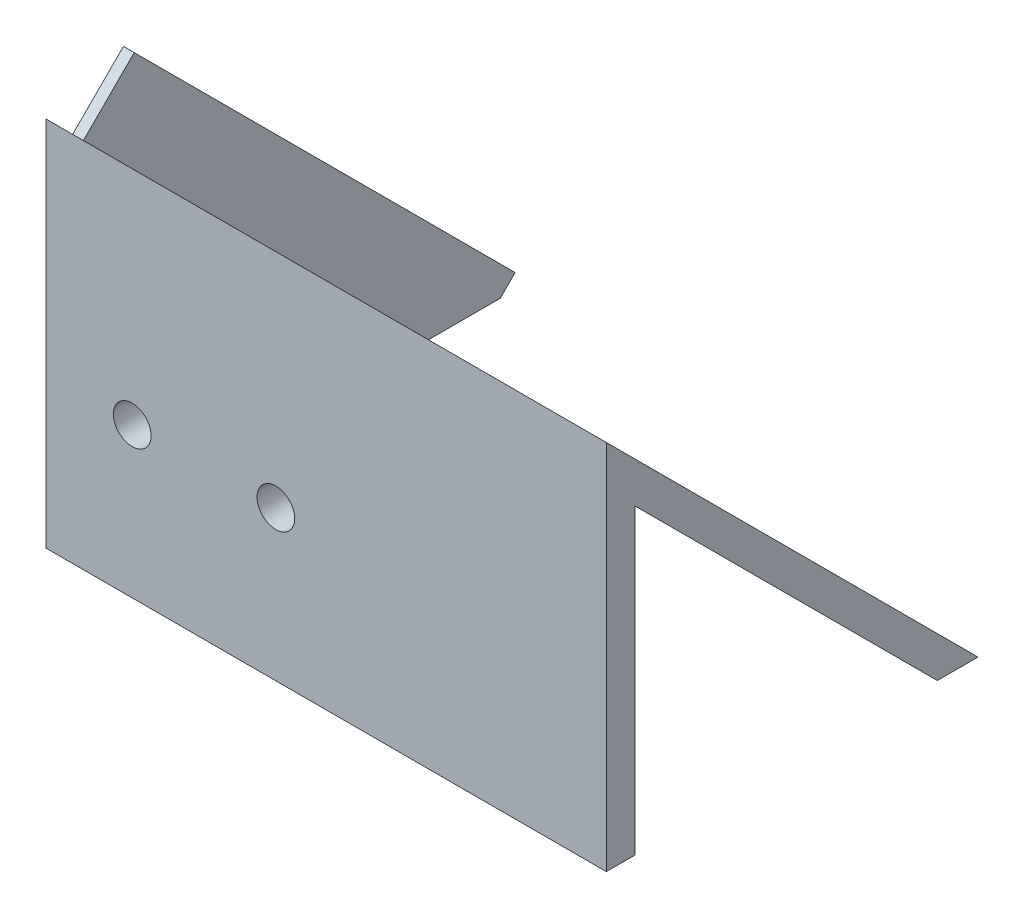
ISO-10303-21;
HEADER;
FILE_DESCRIPTION(('STEP AP214'),'2;1');
FILE_NAME('part.step','',(''),(''),'','','');
FILE_SCHEMA(('AUTOMOTIVE_DESIGN { 1 0 10303 214 1 1 1 1 }'));
ENDSEC;
DATA;
#1=APPLICATION_CONTEXT('core data for automotive mechanical design processes');
#2=APPLICATION_PROTOCOL_DEFINITION('international standard','automotive_design',2000,#1);
#3=PRODUCT_CONTEXT('',#1,'mechanical');
#4=PRODUCT('Part','Part','',(#3));
#5=PRODUCT_RELATED_PRODUCT_CATEGORY('part','',(#4));
#6=PRODUCT_DEFINITION_FORMATION('','',#4);
#7=PRODUCT_DEFINITION_CONTEXT('part definition',#1,'design');
#8=PRODUCT_DEFINITION('design','',#6,#7);
#9=PRODUCT_DEFINITION_SHAPE('','',#8);
#10=(LENGTH_UNIT() NAMED_UNIT(*) SI_UNIT(.MILLI.,.METRE.));
#11=(NAMED_UNIT(*) PLANE_ANGLE_UNIT() SI_UNIT($,.RADIAN.));
#12=(NAMED_UNIT(*) SI_UNIT($,.STERADIAN.) SOLID_ANGLE_UNIT());
#13=UNCERTAINTY_MEASURE_WITH_UNIT(LENGTH_MEASURE(1.E-05),#10,'distance_accuracy_value','');
#14=(GEOMETRIC_REPRESENTATION_CONTEXT(3) GLOBAL_UNCERTAINTY_ASSIGNED_CONTEXT((#13)) GLOBAL_UNIT_ASSIGNED_CONTEXT((#10,
#11,#12)) REPRESENTATION_CONTEXT('',''));
#15=CARTESIAN_POINT('',(0.,0.,0.));
#16=DIRECTION('',(0.,0.,1.));
#17=DIRECTION('',(1.,0.,0.));
#18=AXIS2_PLACEMENT_3D('',#15,#16,#17);
#19=CARTESIAN_POINT('',(78.,56.74,0.));
#20=DIRECTION('',(0.,-0.707106781186548,0.707106781186547));
#21=DIRECTION('',(0.,-0.707106781186547,-0.707106781186548));
#22=AXIS2_PLACEMENT_3D('',#19,#20,#21);
#23=PLANE('',#22);
#24=DIRECTION('',(0.,0.707106781186547,0.707106781186548));
#25=VECTOR('',#24,1.);
#26=CARTESIAN_POINT('',(78.,56.74,0.));
#27=LINE('',#26,#25);
#28=CARTESIAN_POINT('',(78.,5.,-51.7400000000001));
#29=VERTEX_POINT('',#28);
#30=CARTESIAN_POINT('',(78.,56.74,0.));
#31=VERTEX_POINT('',#30);
#32=EDGE_CURVE('E136',#29,#31,#27,.T.);
#33=ORIENTED_EDGE('',*,*,#32,.F.);
#34=DIRECTION('',(-1.,0.,0.));
#35=VECTOR('',#34,1.);
#36=CARTESIAN_POINT('',(78.,5.,-51.7400000000001));
#37=LINE('',#36,#35);
#38=CARTESIAN_POINT('',(1.5,5.,-51.7400000000001));
#39=VERTEX_POINT('',#38);
#40=EDGE_CURVE('E185',#29,#39,#37,.T.);
#41=ORIENTED_EDGE('',*,*,#40,.T.);
#42=DIRECTION('',(0.,-0.707106781186547,-0.707106781186548));
#43=VECTOR('',#42,1.);
#44=CARTESIAN_POINT('',(1.5,0.,-56.7400000000001));
#45=LINE('',#44,#43);
#46=CARTESIAN_POINT('',(1.5,53.033008588991,-3.70699141100899));
#47=VERTEX_POINT('',#46);
#48=EDGE_CURVE('E218',#47,#39,#45,.T.);
#49=ORIENTED_EDGE('',*,*,#48,.F.);
#50=DIRECTION('',(1.,0.,0.));
#51=VECTOR('',#50,1.);
#52=CARTESIAN_POINT('',(0.,53.033008588991,-3.70699141100899));
#53=LINE('',#52,#51);
#54=CARTESIAN_POINT('',(0.,53.033008588991,-3.70699141100899));
#55=VERTEX_POINT('',#54);
#56=EDGE_CURVE('E206',#55,#47,#53,.T.);
#57=ORIENTED_EDGE('',*,*,#56,.F.);
#58=DIRECTION('',(0.,0.707106781186547,0.707106781186548));
#59=VECTOR('',#58,1.);
#60=CARTESIAN_POINT('',(0.,56.74,0.));
#61=LINE('',#60,#59);
#62=CARTESIAN_POINT('',(0.,56.74,0.));
#63=VERTEX_POINT('',#62);
#64=EDGE_CURVE('E156',#55,#63,#61,.T.);
#65=ORIENTED_EDGE('',*,*,#64,.T.);
#66=DIRECTION('',(-1.,0.,0.));
#67=VECTOR('',#66,1.);
#68=CARTESIAN_POINT('',(78.,56.74,0.));
#69=LINE('',#68,#67);
#70=EDGE_CURVE('E139',#31,#63,#69,.T.);
#71=ORIENTED_EDGE('',*,*,#70,.F.);
#72=EDGE_LOOP('',(#33,#41,#49,#57,#65,#71));
#73=FACE_BOUND('',#72,.T.);
#74=ADVANCED_FACE('F38',(#73),#23,.F.);
#75=CARTESIAN_POINT('',(78.,0.,-4.));
#76=DIRECTION('',(0.,0.,1.));
#77=DIRECTION('',(1.,0.,0.));
#78=AXIS2_PLACEMENT_3D('',#75,#76,#77);
#79=PLANE('',#78);
#80=CARTESIAN_POINT('',(12.,25.86,-4.));
#81=DIRECTION('',(0.,0.,1.));
#82=DIRECTION('',(1.,0.,0.));
#83=AXIS2_PLACEMENT_3D('',#80,#81,#82);
#84=CIRCLE('',#83,2.625);
#85=CARTESIAN_POINT('',(14.625,25.86,-4.00000000000001));
#86=VERTEX_POINT('',#85);
#87=EDGE_CURVE('E201',#86,#86,#84,.F.);
#88=ORIENTED_EDGE('',*,*,#87,.F.);
#89=EDGE_LOOP('',(#88));
#90=FACE_BOUND('',#89,.T.);
#91=CARTESIAN_POINT('',(32.,25.86,-4.));
#92=DIRECTION('',(0.,0.,1.));
#93=DIRECTION('',(1.,0.,0.));
#94=AXIS2_PLACEMENT_3D('',#91,#92,#93);
#95=CIRCLE('',#94,2.625);
#96=CARTESIAN_POINT('',(34.625,25.86,-4.00000000000001));
#97=VERTEX_POINT('',#96);
#98=EDGE_CURVE('E202',#97,#97,#95,.F.);
#99=ORIENTED_EDGE('',*,*,#98,.F.);
#100=EDGE_LOOP('',(#99));
#101=FACE_BOUND('',#100,.T.);
#102=DIRECTION('',(0.,1.,0.));
#103=VECTOR('',#102,1.);
#104=CARTESIAN_POINT('',(78.,0.,-4.));
#105=LINE('',#104,#103);
#106=CARTESIAN_POINT('',(78.,5.,-4.));
#107=VERTEX_POINT('',#106);
#108=CARTESIAN_POINT('',(78.,47.08,-4.));
#109=VERTEX_POINT('',#108);
#110=EDGE_CURVE('E160',#107,#109,#105,.T.);
#111=ORIENTED_EDGE('',*,*,#110,.F.);
#112=DIRECTION('',(-1.,0.,0.));
#113=VECTOR('',#112,1.);
#114=CARTESIAN_POINT('',(78.,5.,-4.));
#115=LINE('',#114,#113);
#116=CARTESIAN_POINT('',(0.,5.,-4.));
#117=VERTEX_POINT('',#116);
#118=EDGE_CURVE('E116',#107,#117,#115,.T.);
#119=ORIENTED_EDGE('',*,*,#118,.T.);
#120=DIRECTION('',(0.,1.,0.));
#121=VECTOR('',#120,1.);
#122=CARTESIAN_POINT('',(0.,0.,-4.));
#123=LINE('',#122,#121);
#124=CARTESIAN_POINT('',(0.,47.08,-4.));
#125=VERTEX_POINT('',#124);
#126=EDGE_CURVE('E148',#117,#125,#123,.T.);
#127=ORIENTED_EDGE('',*,*,#126,.T.);
#128=DIRECTION('',(-1.,0.,0.));
#129=VECTOR('',#128,1.);
#130=CARTESIAN_POINT('',(78.,47.08,-4.));
#131=LINE('',#130,#129);
#132=EDGE_CURVE('E47',#109,#125,#131,.T.);
#133=ORIENTED_EDGE('',*,*,#132,.F.);
#134=EDGE_LOOP('',(#111,#119,#127,#133));
#135=FACE_BOUND('',#134,.T.);
#136=ADVANCED_FACE('F40',(#90,#101,#135),#79,.F.);
#137=CARTESIAN_POINT('',(78.,47.08,-4.));
#138=DIRECTION('',(0.,0.707106781186553,-0.707106781186542));
#139=DIRECTION('',(0.,0.707106781186542,0.707106781186553));
#140=AXIS2_PLACEMENT_3D('',#137,#138,#139);
#141=PLANE('',#140);
#142=DIRECTION('',(0.,-0.707106781186542,-0.707106781186553));
#143=VECTOR('',#142,1.);
#144=CARTESIAN_POINT('',(0.,47.08,-4.));
#145=LINE('',#144,#143);
#146=CARTESIAN_POINT('',(0.,5.,-46.0800000000006));
#147=VERTEX_POINT('',#146);
#148=EDGE_CURVE('E151',#125,#147,#145,.T.);
#149=ORIENTED_EDGE('',*,*,#148,.T.);
#150=DIRECTION('',(1.,0.,0.));
#151=VECTOR('',#150,1.);
#152=CARTESIAN_POINT('',(78.,5.,-46.0800000000006));
#153=LINE('',#152,#151);
#154=CARTESIAN_POINT('',(78.,5.,-46.0800000000006));
#155=VERTEX_POINT('',#154);
#156=EDGE_CURVE('E191',#147,#155,#153,.T.);
#157=ORIENTED_EDGE('',*,*,#156,.T.);
#158=DIRECTION('',(0.,-0.707106781186542,-0.707106781186553));
#159=VECTOR('',#158,1.);
#160=CARTESIAN_POINT('',(78.,47.08,-4.));
#161=LINE('',#160,#159);
#162=EDGE_CURVE('E144',#109,#155,#161,.T.);
#163=ORIENTED_EDGE('',*,*,#162,.F.);
#164=ORIENTED_EDGE('',*,*,#132,.T.);
#165=EDGE_LOOP('',(#149,#157,#163,#164));
#166=FACE_BOUND('',#165,.T.);
#167=ADVANCED_FACE('F167',(#166),#141,.F.);
#168=CARTESIAN_POINT('',(78.,0.,0.));
#169=DIRECTION('',(0.,0.,-1.));
#170=DIRECTION('',(-1.,0.,0.));
#171=AXIS2_PLACEMENT_3D('',#168,#169,#170);
#172=PLANE('',#171);
#173=CARTESIAN_POINT('',(12.,25.86,0.));
#174=DIRECTION('',(0.,0.,1.));
#175=DIRECTION('',(1.,0.,0.));
#176=AXIS2_PLACEMENT_3D('',#173,#174,#175);
#177=CIRCLE('',#176,2.625);
#178=CARTESIAN_POINT('',(14.625,25.86,0.));
#179=VERTEX_POINT('',#178);
#180=EDGE_CURVE('E197',#179,#179,#177,.T.);
#181=ORIENTED_EDGE('',*,*,#180,.F.);
#182=EDGE_LOOP('',(#181));
#183=FACE_BOUND('',#182,.T.);
#184=CARTESIAN_POINT('',(32.,25.86,0.));
#185=DIRECTION('',(0.,0.,1.));
#186=DIRECTION('',(1.,0.,0.));
#187=AXIS2_PLACEMENT_3D('',#184,#185,#186);
#188=CIRCLE('',#187,2.625);
#189=CARTESIAN_POINT('',(34.625,25.86,0.));
#190=VERTEX_POINT('',#189);
#191=EDGE_CURVE('E196',#190,#190,#188,.T.);
#192=ORIENTED_EDGE('',*,*,#191,.F.);
#193=EDGE_LOOP('',(#192));
#194=FACE_BOUND('',#193,.T.);
#195=DIRECTION('',(0.,-1.,0.));
#196=VECTOR('',#195,1.);
#197=CARTESIAN_POINT('',(0.,0.,0.));
#198=LINE('',#197,#196);
#199=CARTESIAN_POINT('',(0.,5.,0.));
#200=VERTEX_POINT('',#199);
#201=EDGE_CURVE('E130',#63,#200,#198,.T.);
#202=ORIENTED_EDGE('',*,*,#201,.T.);
#203=DIRECTION('',(-1.,0.,0.));
#204=VECTOR('',#203,1.);
#205=CARTESIAN_POINT('',(0.,5.,0.));
#206=LINE('',#205,#204);
#207=CARTESIAN_POINT('',(78.,5.,0.));
#208=VERTEX_POINT('',#207);
#209=EDGE_CURVE('E54',#208,#200,#206,.T.);
#210=ORIENTED_EDGE('',*,*,#209,.F.);
#211=DIRECTION('',(0.,-1.,0.));
#212=VECTOR('',#211,1.);
#213=CARTESIAN_POINT('',(78.,0.,0.));
#214=LINE('',#213,#212);
#215=EDGE_CURVE('E128',#31,#208,#214,.T.);
#216=ORIENTED_EDGE('',*,*,#215,.F.);
#217=ORIENTED_EDGE('',*,*,#70,.T.);
#218=EDGE_LOOP('',(#202,#210,#216,#217));
#219=FACE_BOUND('',#218,.T.);
#220=ADVANCED_FACE('F126',(#183,#194,#219),#172,.F.);
#221=CARTESIAN_POINT('',(78.,0.,0.));
#222=DIRECTION('',(-1.,0.,0.));
#223=DIRECTION('',(0.,0.,1.));
#224=AXIS2_PLACEMENT_3D('',#221,#222,#223);
#225=PLANE('',#224);
#226=ORIENTED_EDGE('',*,*,#215,.T.);
#227=DIRECTION('',(0.,0.,1.));
#228=VECTOR('',#227,1.);
#229=CARTESIAN_POINT('',(78.,5.,-63.8110678118656));
#230=LINE('',#229,#228);
#231=EDGE_CURVE('E113',#107,#208,#230,.T.);
#232=ORIENTED_EDGE('',*,*,#231,.F.);
#233=ORIENTED_EDGE('',*,*,#110,.T.);
#234=ORIENTED_EDGE('',*,*,#162,.T.);
#235=EDGE_CURVE('E121',#29,#155,#230,.T.);
#236=ORIENTED_EDGE('',*,*,#235,.F.);
#237=ORIENTED_EDGE('',*,*,#32,.T.);
#238=EDGE_LOOP('',(#226,#232,#233,#234,#236,#237));
#239=FACE_BOUND('',#238,.T.);
#240=ADVANCED_FACE('F133',(#239),#225,.F.);
#241=CARTESIAN_POINT('',(0.,0.,0.));
#242=DIRECTION('',(-1.,0.,0.));
#243=DIRECTION('',(0.,0.,1.));
#244=AXIS2_PLACEMENT_3D('',#241,#242,#243);
#245=PLANE('',#244);
#246=DIRECTION('',(0.,0.,1.));
#247=VECTOR('',#246,1.);
#248=CARTESIAN_POINT('',(0.,5.,-63.8110678118656));
#249=LINE('',#248,#247);
#250=EDGE_CURVE('E180',#117,#200,#249,.T.);
#251=ORIENTED_EDGE('',*,*,#250,.T.);
#252=ORIENTED_EDGE('',*,*,#201,.F.);
#253=ORIENTED_EDGE('',*,*,#64,.F.);
#254=DIRECTION('',(0.,-0.707106781186548,0.707106781186547));
#255=VECTOR('',#254,1.);
#256=CARTESIAN_POINT('',(0.,60.1040764008565,-10.7780592228745));
#257=LINE('',#256,#255);
#258=CARTESIAN_POINT('',(0.,60.1040764008565,-10.7780592228745));
#259=VERTEX_POINT('',#258);
#260=EDGE_CURVE('E152',#259,#55,#257,.T.);
#261=ORIENTED_EDGE('',*,*,#260,.F.);
#262=DIRECTION('',(0.,0.707106781186547,0.707106781186548));
#263=VECTOR('',#262,1.);
#264=CARTESIAN_POINT('',(0.,7.0710678118655,-63.8110678118656));
#265=LINE('',#264,#263);
#266=CARTESIAN_POINT('',(0.,7.0710678118655,-63.8110678118656));
#267=VERTEX_POINT('',#266);
#268=EDGE_CURVE('E213',#267,#259,#265,.T.);
#269=ORIENTED_EDGE('',*,*,#268,.F.);
#270=DIRECTION('',(0.,-0.707106781186548,0.707106781186547));
#271=VECTOR('',#270,1.);
#272=CARTESIAN_POINT('',(0.,7.0710678118655,-63.8110678118656));
#273=LINE('',#272,#271);
#274=CARTESIAN_POINT('',(0.,5.,-61.7400000000001));
#275=VERTEX_POINT('',#274);
#276=EDGE_CURVE('E177',#267,#275,#273,.T.);
#277=ORIENTED_EDGE('',*,*,#276,.T.);
#278=EDGE_CURVE('E62',#275,#147,#249,.T.);
#279=ORIENTED_EDGE('',*,*,#278,.T.);
#280=ORIENTED_EDGE('',*,*,#148,.F.);
#281=ORIENTED_EDGE('',*,*,#126,.F.);
#282=EDGE_LOOP('',(#251,#252,#253,#261,#269,#277,#279,#280,#281));
#283=FACE_BOUND('',#282,.T.);
#284=ADVANCED_FACE('F173',(#283),#245,.T.);
#285=CARTESIAN_POINT('',(0.,60.1040764008565,-10.7780592228745));
#286=DIRECTION('',(0.,-0.707106781186547,-0.707106781186548));
#287=DIRECTION('',(0.,0.707106781186548,-0.707106781186547));
#288=AXIS2_PLACEMENT_3D('',#285,#286,#287);
#289=PLANE('',#288);
#290=ORIENTED_EDGE('',*,*,#56,.T.);
#291=DIRECTION('',(0.,-0.707106781186548,0.707106781186547));
#292=VECTOR('',#291,1.);
#293=CARTESIAN_POINT('',(1.50000000000001,60.1040764008565,-10.7780592228745));
#294=LINE('',#293,#292);
#295=CARTESIAN_POINT('',(1.50000000000001,60.1040764008565,-10.7780592228745));
#296=VERTEX_POINT('',#295);
#297=EDGE_CURVE('E239',#296,#47,#294,.T.);
#298=ORIENTED_EDGE('',*,*,#297,.F.);
#299=DIRECTION('',(1.,0.,0.));
#300=VECTOR('',#299,1.);
#301=CARTESIAN_POINT('',(0.,60.1040764008565,-10.7780592228745));
#302=LINE('',#301,#300);
#303=EDGE_CURVE('E217',#259,#296,#302,.T.);
#304=ORIENTED_EDGE('',*,*,#303,.F.);
#305=ORIENTED_EDGE('',*,*,#260,.T.);
#306=EDGE_LOOP('',(#290,#298,#304,#305));
#307=FACE_BOUND('',#306,.T.);
#308=ADVANCED_FACE('F284',(#307),#289,.F.);
#309=CARTESIAN_POINT('',(1.5,7.0710678118655,-63.8110678118656));
#310=DIRECTION('',(-1.,0.,0.));
#311=DIRECTION('',(0.,0.,1.));
#312=AXIS2_PLACEMENT_3D('',#309,#310,#311);
#313=PLANE('',#312);
#314=ORIENTED_EDGE('',*,*,#48,.T.);
#315=DIRECTION('',(0.,0.,-1.));
#316=VECTOR('',#315,1.);
#317=CARTESIAN_POINT('',(1.5,5.,-63.8110678118656));
#318=LINE('',#317,#316);
#319=CARTESIAN_POINT('',(1.5,5.,-61.7400000000001));
#320=VERTEX_POINT('',#319);
#321=EDGE_CURVE('E179',#39,#320,#318,.T.);
#322=ORIENTED_EDGE('',*,*,#321,.T.);
#323=DIRECTION('',(0.,-0.707106781186548,0.707106781186547));
#324=VECTOR('',#323,1.);
#325=CARTESIAN_POINT('',(1.5,7.0710678118655,-63.8110678118656));
#326=LINE('',#325,#324);
#327=CARTESIAN_POINT('',(1.5,7.0710678118655,-63.8110678118656));
#328=VERTEX_POINT('',#327);
#329=EDGE_CURVE('E235',#328,#320,#326,.T.);
#330=ORIENTED_EDGE('',*,*,#329,.F.);
#331=DIRECTION('',(0.,-0.707106781186547,-0.707106781186548));
#332=VECTOR('',#331,1.);
#333=CARTESIAN_POINT('',(1.5,7.0710678118655,-63.8110678118656));
#334=LINE('',#333,#332);
#335=EDGE_CURVE('E221',#296,#328,#334,.T.);
#336=ORIENTED_EDGE('',*,*,#335,.F.);
#337=ORIENTED_EDGE('',*,*,#297,.T.);
#338=EDGE_LOOP('',(#314,#322,#330,#336,#337));
#339=FACE_BOUND('',#338,.T.);
#340=ADVANCED_FACE('F280',(#339),#313,.F.);
#341=CARTESIAN_POINT('',(0.,7.0710678118655,-63.8110678118656));
#342=DIRECTION('',(0.,0.707106781186547,0.707106781186548));
#343=DIRECTION('',(0.,-0.707106781186548,0.707106781186547));
#344=AXIS2_PLACEMENT_3D('',#341,#342,#343);
#345=PLANE('',#344);
#346=ORIENTED_EDGE('',*,*,#329,.T.);
#347=DIRECTION('',(-1.,0.,0.));
#348=VECTOR('',#347,1.);
#349=CARTESIAN_POINT('',(0.,5.,-61.7400000000001));
#350=LINE('',#349,#348);
#351=EDGE_CURVE('E11',#320,#275,#350,.T.);
#352=ORIENTED_EDGE('',*,*,#351,.T.);
#353=ORIENTED_EDGE('',*,*,#276,.F.);
#354=DIRECTION('',(-1.,0.,0.));
#355=VECTOR('',#354,1.);
#356=CARTESIAN_POINT('',(0.,7.0710678118655,-63.8110678118656));
#357=LINE('',#356,#355);
#358=EDGE_CURVE('E224',#328,#267,#357,.T.);
#359=ORIENTED_EDGE('',*,*,#358,.F.);
#360=EDGE_LOOP('',(#346,#352,#353,#359));
#361=FACE_BOUND('',#360,.T.);
#362=ADVANCED_FACE('F273',(#361),#345,.F.);
#363=CARTESIAN_POINT('',(0.,35.4410678118655,-35.4410678118655));
#364=DIRECTION('',(0.,0.707106781186548,-0.707106781186547));
#365=DIRECTION('',(0.,0.707106781186547,0.707106781186548));
#366=AXIS2_PLACEMENT_3D('',#363,#364,#365);
#367=PLANE('',#366);
#368=ORIENTED_EDGE('',*,*,#268,.T.);
#369=ORIENTED_EDGE('',*,*,#303,.T.);
#370=ORIENTED_EDGE('',*,*,#335,.T.);
#371=ORIENTED_EDGE('',*,*,#358,.T.);
#372=EDGE_LOOP('',(#368,#369,#370,#371));
#373=FACE_BOUND('',#372,.T.);
#374=ADVANCED_FACE('F263',(#373),#367,.T.);
#375=CARTESIAN_POINT('',(32.,25.86,-63.8120678118656));
#376=DIRECTION('',(0.,0.,1.));
#377=DIRECTION('',(1.,0.,0.));
#378=AXIS2_PLACEMENT_3D('',#375,#376,#377);
#379=CYLINDRICAL_SURFACE('',#378,2.625);
#380=CARTESIAN_POINT('',(34.625,25.86,0.));
#381=CARTESIAN_POINT('',(34.625,25.86,-0.0416666666666805));
#382=CARTESIAN_POINT('',(34.625,25.86,-0.0833333333333473));
#383=CARTESIAN_POINT('',(34.625,25.86,-0.166666666666681));
#384=CARTESIAN_POINT('',(34.625,25.86,-0.208333333333347));
#385=CARTESIAN_POINT('',(34.625,25.86,-0.291666666666681));
#386=CARTESIAN_POINT('',(34.625,25.86,-0.333333333333347));
#387=CARTESIAN_POINT('',(34.625,25.86,-0.416666666666681));
#388=CARTESIAN_POINT('',(34.625,25.86,-0.458333333333348));
#389=CARTESIAN_POINT('',(34.625,25.86,-0.541666666666681));
#390=CARTESIAN_POINT('',(34.625,25.86,-0.583333333333348));
#391=CARTESIAN_POINT('',(34.625,25.86,-0.666666666666681));
#392=CARTESIAN_POINT('',(34.625,25.86,-0.708333333333348));
#393=CARTESIAN_POINT('',(34.625,25.86,-0.791666666666681));
#394=CARTESIAN_POINT('',(34.625,25.86,-0.833333333333348));
#395=CARTESIAN_POINT('',(34.625,25.86,-0.916666666666681));
#396=CARTESIAN_POINT('',(34.625,25.86,-0.958333333333348));
#397=CARTESIAN_POINT('',(34.625,25.86,-1.04166666666668));
#398=CARTESIAN_POINT('',(34.625,25.86,-1.08333333333335));
#399=CARTESIAN_POINT('',(34.625,25.86,-1.16666666666668));
#400=CARTESIAN_POINT('',(34.625,25.86,-1.20833333333335));
#401=CARTESIAN_POINT('',(34.625,25.86,-1.29166666666668));
#402=CARTESIAN_POINT('',(34.625,25.86,-1.33333333333334));
#403=CARTESIAN_POINT('',(34.625,25.86,-1.41666666666667));
#404=CARTESIAN_POINT('',(34.625,25.86,-1.45833333333334));
#405=CARTESIAN_POINT('',(34.625,25.86,-1.54166666666667));
#406=CARTESIAN_POINT('',(34.625,25.86,-1.58333333333334));
#407=CARTESIAN_POINT('',(34.625,25.86,-1.66666666666667));
#408=CARTESIAN_POINT('',(34.625,25.86,-1.70833333333334));
#409=CARTESIAN_POINT('',(34.625,25.86,-1.79166666666668));
#410=CARTESIAN_POINT('',(34.625,25.86,-1.83333333333334));
#411=CARTESIAN_POINT('',(34.625,25.86,-1.91666666666668));
#412=CARTESIAN_POINT('',(34.625,25.86,-1.95833333333334));
#413=CARTESIAN_POINT('',(34.625,25.86,-2.04166666666668));
#414=CARTESIAN_POINT('',(34.625,25.86,-2.08333333333334));
#415=CARTESIAN_POINT('',(34.625,25.86,-2.16666666666668));
#416=CARTESIAN_POINT('',(34.625,25.86,-2.20833333333334));
#417=CARTESIAN_POINT('',(34.625,25.86,-2.29166666666668));
#418=CARTESIAN_POINT('',(34.625,25.86,-2.33333333333334));
#419=CARTESIAN_POINT('',(34.625,25.86,-2.41666666666668));
#420=CARTESIAN_POINT('',(34.625,25.86,-2.45833333333334));
#421=CARTESIAN_POINT('',(34.625,25.86,-2.54166666666668));
#422=CARTESIAN_POINT('',(34.625,25.86,-2.58333333333334));
#423=CARTESIAN_POINT('',(34.625,25.86,-2.66666666666668));
#424=CARTESIAN_POINT('',(34.625,25.86,-2.70833333333334));
#425=CARTESIAN_POINT('',(34.625,25.86,-2.79166666666668));
#426=CARTESIAN_POINT('',(34.625,25.86,-2.83333333333334));
#427=CARTESIAN_POINT('',(34.625,25.86,-2.91666666666668));
#428=CARTESIAN_POINT('',(34.625,25.86,-2.95833333333334));
#429=CARTESIAN_POINT('',(34.625,25.86,-3.04166666666668));
#430=CARTESIAN_POINT('',(34.625,25.86,-3.08333333333334));
#431=CARTESIAN_POINT('',(34.625,25.86,-3.16666666666668));
#432=CARTESIAN_POINT('',(34.625,25.86,-3.20833333333334));
#433=CARTESIAN_POINT('',(34.625,25.86,-3.29166666666668));
#434=CARTESIAN_POINT('',(34.625,25.86,-3.33333333333334));
#435=CARTESIAN_POINT('',(34.625,25.86,-3.41666666666668));
#436=CARTESIAN_POINT('',(34.625,25.86,-3.45833333333334));
#437=CARTESIAN_POINT('',(34.625,25.86,-3.54166666666668));
#438=CARTESIAN_POINT('',(34.625,25.86,-3.58333333333334));
#439=CARTESIAN_POINT('',(34.625,25.86,-3.66666666666668));
#440=CARTESIAN_POINT('',(34.625,25.86,-3.70833333333334));
#441=CARTESIAN_POINT('',(34.625,25.86,-3.79166666666668));
#442=CARTESIAN_POINT('',(34.625,25.86,-3.83333333333334));
#443=CARTESIAN_POINT('',(34.625,25.86,-3.91666666666668));
#444=CARTESIAN_POINT('',(34.625,25.86,-3.95833333333334));
#445=CARTESIAN_POINT('',(34.625,25.86,-4.00000000000001));
#446=B_SPLINE_CURVE_WITH_KNOTS('',3,(#380,#381,#382,#383,#384,#385,#386,#387,#388,#389,#390,
#391,#392,#393,#394,#395,#396,#397,#398,#399,#400,#401,#402,#403,#404,#405,#406,#407,#408,#409,
#410,#411,#412,#413,#414,#415,#416,#417,#418,#419,#420,#421,#422,#423,#424,#425,#426,#427,#428,
#429,#430,#431,#432,#433,#434,#435,#436,#437,#438,#439,#440,#441,#442,#443,#444,#445),
.UNSPECIFIED.,.F.,.F.,(4,2,2,2,2,2,2,2,2,2,2,2,2,2,2,2,2,2,2,2,2,2,2,2,2,2,2,2,2,2,2,2,4),(0.,
0.125,0.25,0.375,0.5,0.625000000000001,0.750000000000001,0.875000000000001,1.,1.125,1.25,
1.37499999999999,1.49999999999999,1.62499999999999,1.74999999999999,1.87499999999999,
1.99999999999999,2.125,2.25,2.375,2.5,2.625,2.75,2.875,3.,3.125,3.25,3.375,3.5,3.625,3.75,3.875,
4.),.UNSPECIFIED.);
#447=EDGE_CURVE('BSEAM260',#190,#97,#446,.T.);
#448=ORIENTED_EDGE('',*,*,#191,.T.);
#449=ORIENTED_EDGE('',*,*,#98,.T.);
#450=ORIENTED_EDGE('',*,*,#447,.T.);
#451=ORIENTED_EDGE('',*,*,#447,.F.);
#452=EDGE_LOOP('',(#448,#450,#449,#451));
#453=FACE_BOUND('',#452,.T.);
#454=ADVANCED_FACE('F260',(#453),#379,.F.);
#455=CARTESIAN_POINT('',(12.,25.86,-63.8120678118656));
#456=DIRECTION('',(0.,0.,1.));
#457=DIRECTION('',(1.,0.,0.));
#458=AXIS2_PLACEMENT_3D('',#455,#456,#457);
#459=CYLINDRICAL_SURFACE('',#458,2.625);
#460=CARTESIAN_POINT('',(14.625,25.86,0.));
#461=CARTESIAN_POINT('',(14.625,25.86,-0.0416666666666805));
#462=CARTESIAN_POINT('',(14.625,25.86,-0.0833333333333473));
#463=CARTESIAN_POINT('',(14.625,25.86,-0.166666666666681));
#464=CARTESIAN_POINT('',(14.625,25.86,-0.208333333333347));
#465=CARTESIAN_POINT('',(14.625,25.86,-0.291666666666681));
#466=CARTESIAN_POINT('',(14.625,25.86,-0.333333333333347));
#467=CARTESIAN_POINT('',(14.625,25.86,-0.416666666666681));
#468=CARTESIAN_POINT('',(14.625,25.86,-0.458333333333348));
#469=CARTESIAN_POINT('',(14.625,25.86,-0.541666666666681));
#470=CARTESIAN_POINT('',(14.625,25.86,-0.583333333333348));
#471=CARTESIAN_POINT('',(14.625,25.86,-0.666666666666681));
#472=CARTESIAN_POINT('',(14.625,25.86,-0.708333333333348));
#473=CARTESIAN_POINT('',(14.625,25.86,-0.791666666666681));
#474=CARTESIAN_POINT('',(14.625,25.86,-0.833333333333348));
#475=CARTESIAN_POINT('',(14.625,25.86,-0.916666666666681));
#476=CARTESIAN_POINT('',(14.625,25.86,-0.958333333333348));
#477=CARTESIAN_POINT('',(14.625,25.86,-1.04166666666668));
#478=CARTESIAN_POINT('',(14.625,25.86,-1.08333333333335));
#479=CARTESIAN_POINT('',(14.625,25.86,-1.16666666666668));
#480=CARTESIAN_POINT('',(14.625,25.86,-1.20833333333335));
#481=CARTESIAN_POINT('',(14.625,25.86,-1.29166666666668));
#482=CARTESIAN_POINT('',(14.625,25.86,-1.33333333333334));
#483=CARTESIAN_POINT('',(14.625,25.86,-1.41666666666667));
#484=CARTESIAN_POINT('',(14.625,25.86,-1.45833333333334));
#485=CARTESIAN_POINT('',(14.625,25.86,-1.54166666666667));
#486=CARTESIAN_POINT('',(14.625,25.86,-1.58333333333334));
#487=CARTESIAN_POINT('',(14.625,25.86,-1.66666666666667));
#488=CARTESIAN_POINT('',(14.625,25.86,-1.70833333333334));
#489=CARTESIAN_POINT('',(14.625,25.86,-1.79166666666668));
#490=CARTESIAN_POINT('',(14.625,25.86,-1.83333333333334));
#491=CARTESIAN_POINT('',(14.625,25.86,-1.91666666666668));
#492=CARTESIAN_POINT('',(14.625,25.86,-1.95833333333334));
#493=CARTESIAN_POINT('',(14.625,25.86,-2.04166666666668));
#494=CARTESIAN_POINT('',(14.625,25.86,-2.08333333333334));
#495=CARTESIAN_POINT('',(14.625,25.86,-2.16666666666668));
#496=CARTESIAN_POINT('',(14.625,25.86,-2.20833333333334));
#497=CARTESIAN_POINT('',(14.625,25.86,-2.29166666666668));
#498=CARTESIAN_POINT('',(14.625,25.86,-2.33333333333334));
#499=CARTESIAN_POINT('',(14.625,25.86,-2.41666666666668));
#500=CARTESIAN_POINT('',(14.625,25.86,-2.45833333333334));
#501=CARTESIAN_POINT('',(14.625,25.86,-2.54166666666668));
#502=CARTESIAN_POINT('',(14.625,25.86,-2.58333333333334));
#503=CARTESIAN_POINT('',(14.625,25.86,-2.66666666666668));
#504=CARTESIAN_POINT('',(14.625,25.86,-2.70833333333334));
#505=CARTESIAN_POINT('',(14.625,25.86,-2.79166666666668));
#506=CARTESIAN_POINT('',(14.625,25.86,-2.83333333333334));
#507=CARTESIAN_POINT('',(14.625,25.86,-2.91666666666668));
#508=CARTESIAN_POINT('',(14.625,25.86,-2.95833333333334));
#509=CARTESIAN_POINT('',(14.625,25.86,-3.04166666666668));
#510=CARTESIAN_POINT('',(14.625,25.86,-3.08333333333334));
#511=CARTESIAN_POINT('',(14.625,25.86,-3.16666666666668));
#512=CARTESIAN_POINT('',(14.625,25.86,-3.20833333333334));
#513=CARTESIAN_POINT('',(14.625,25.86,-3.29166666666668));
#514=CARTESIAN_POINT('',(14.625,25.86,-3.33333333333334));
#515=CARTESIAN_POINT('',(14.625,25.86,-3.41666666666668));
#516=CARTESIAN_POINT('',(14.625,25.86,-3.45833333333334));
#517=CARTESIAN_POINT('',(14.625,25.86,-3.54166666666668));
#518=CARTESIAN_POINT('',(14.625,25.86,-3.58333333333334));
#519=CARTESIAN_POINT('',(14.625,25.86,-3.66666666666668));
#520=CARTESIAN_POINT('',(14.625,25.86,-3.70833333333334));
#521=CARTESIAN_POINT('',(14.625,25.86,-3.79166666666668));
#522=CARTESIAN_POINT('',(14.625,25.86,-3.83333333333334));
#523=CARTESIAN_POINT('',(14.625,25.86,-3.91666666666668));
#524=CARTESIAN_POINT('',(14.625,25.86,-3.95833333333334));
#525=CARTESIAN_POINT('',(14.625,25.86,-4.00000000000001));
#526=B_SPLINE_CURVE_WITH_KNOTS('',3,(#460,#461,#462,#463,#464,#465,#466,#467,#468,#469,#470,
#471,#472,#473,#474,#475,#476,#477,#478,#479,#480,#481,#482,#483,#484,#485,#486,#487,#488,#489,
#490,#491,#492,#493,#494,#495,#496,#497,#498,#499,#500,#501,#502,#503,#504,#505,#506,#507,#508,
#509,#510,#511,#512,#513,#514,#515,#516,#517,#518,#519,#520,#521,#522,#523,#524,#525),
.UNSPECIFIED.,.F.,.F.,(4,2,2,2,2,2,2,2,2,2,2,2,2,2,2,2,2,2,2,2,2,2,2,2,2,2,2,2,2,2,2,2,4),(0.,
0.125,0.25,0.375,0.5,0.625000000000001,0.750000000000001,0.875000000000001,1.,1.125,1.25,
1.37499999999999,1.49999999999999,1.62499999999999,1.74999999999999,1.87499999999999,
1.99999999999999,2.125,2.25,2.375,2.5,2.625,2.75,2.875,3.,3.125,3.25,3.375,3.5,3.625,3.75,3.875,
4.),.UNSPECIFIED.);
#527=EDGE_CURVE('BSEAM262',#179,#86,#526,.T.);
#528=ORIENTED_EDGE('',*,*,#180,.T.);
#529=ORIENTED_EDGE('',*,*,#87,.T.);
#530=ORIENTED_EDGE('',*,*,#527,.T.);
#531=ORIENTED_EDGE('',*,*,#527,.F.);
#532=EDGE_LOOP('',(#528,#530,#529,#531));
#533=FACE_BOUND('',#532,.T.);
#534=ADVANCED_FACE('F262',(#533),#459,.F.);
#535=CARTESIAN_POINT('',(0.,5.,-63.8110678118656));
#536=DIRECTION('',(0.,1.,0.));
#537=DIRECTION('',(0.,0.,1.));
#538=AXIS2_PLACEMENT_3D('',#535,#536,#537);
#539=PLANE('',#538);
#540=ORIENTED_EDGE('',*,*,#278,.F.);
#541=ORIENTED_EDGE('',*,*,#351,.F.);
#542=ORIENTED_EDGE('',*,*,#321,.F.);
#543=ORIENTED_EDGE('',*,*,#40,.F.);
#544=ORIENTED_EDGE('',*,*,#235,.T.);
#545=ORIENTED_EDGE('',*,*,#156,.F.);
#546=EDGE_LOOP('',(#540,#541,#542,#543,#544,#545));
#547=FACE_BOUND('',#546,.T.);
#548=ADVANCED_FACE('F270',(#547),#539,.F.);
#549=ORIENTED_EDGE('',*,*,#231,.T.);
#550=ORIENTED_EDGE('',*,*,#209,.T.);
#551=ORIENTED_EDGE('',*,*,#250,.F.);
#552=ORIENTED_EDGE('',*,*,#118,.F.);
#553=EDGE_LOOP('',(#549,#550,#551,#552));
#554=FACE_BOUND('',#553,.T.);
#555=ADVANCED_FACE('F114',(#554),#539,.F.);
#556=CLOSED_SHELL('',(#74,#136,#167,#220,#240,#284,#308,#340,#362,#374,#454,#534,#548,#555));
#557=MANIFOLD_SOLID_BREP('B2',#556);
#558=ADVANCED_BREP_SHAPE_REPRESENTATION('',(#18,#557),#14);
#559=SHAPE_DEFINITION_REPRESENTATION(#9,#558);
ENDSEC;
END-ISO-10303-21;
